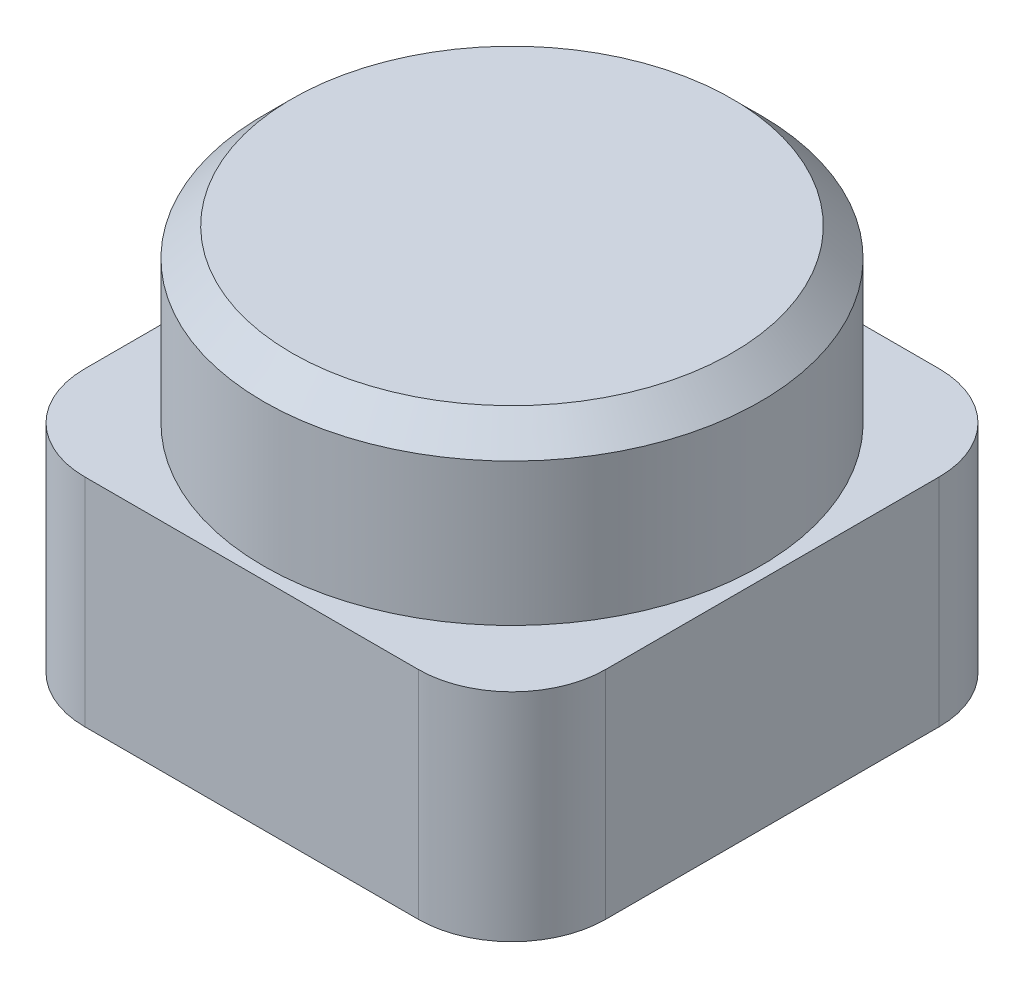
ISO-10303-21;
HEADER;
FILE_DESCRIPTION(('STEP AP214'),'2;1');
FILE_NAME('part.step','',(''),(''),'','','');
FILE_SCHEMA(('AUTOMOTIVE_DESIGN { 1 0 10303 214 1 1 1 1 }'));
ENDSEC;
DATA;
#1=APPLICATION_CONTEXT('core data for automotive mechanical design processes');
#2=APPLICATION_PROTOCOL_DEFINITION('international standard','automotive_design',2000,#1);
#3=PRODUCT_CONTEXT('',#1,'mechanical');
#4=PRODUCT('Part','Part','',(#3));
#5=PRODUCT_RELATED_PRODUCT_CATEGORY('part','',(#4));
#6=PRODUCT_DEFINITION_FORMATION('','',#4);
#7=PRODUCT_DEFINITION_CONTEXT('part definition',#1,'design');
#8=PRODUCT_DEFINITION('design','',#6,#7);
#9=PRODUCT_DEFINITION_SHAPE('','',#8);
#10=(LENGTH_UNIT() NAMED_UNIT(*) SI_UNIT(.MILLI.,.METRE.));
#11=(NAMED_UNIT(*) PLANE_ANGLE_UNIT() SI_UNIT($,.RADIAN.));
#12=(NAMED_UNIT(*) SI_UNIT($,.STERADIAN.) SOLID_ANGLE_UNIT());
#13=UNCERTAINTY_MEASURE_WITH_UNIT(LENGTH_MEASURE(1.E-05),#10,'distance_accuracy_value','');
#14=(GEOMETRIC_REPRESENTATION_CONTEXT(3) GLOBAL_UNCERTAINTY_ASSIGNED_CONTEXT((#13)) GLOBAL_UNIT_ASSIGNED_CONTEXT((#10,
#11,#12)) REPRESENTATION_CONTEXT('',''));
#15=CARTESIAN_POINT('',(0.,0.,0.));
#16=DIRECTION('',(0.,0.,1.));
#17=DIRECTION('',(1.,0.,0.));
#18=AXIS2_PLACEMENT_3D('',#15,#16,#17);
#19=CARTESIAN_POINT('',(0.,23.1,0.));
#20=DIRECTION('',(1.,0.,0.));
#21=DIRECTION('',(0.,0.,-1.));
#22=AXIS2_PLACEMENT_3D('',#19,#20,#21);
#23=PLANE('',#22);
#24=DIRECTION('',(0.,0.,1.));
#25=VECTOR('',#24,1.);
#26=CARTESIAN_POINT('',(0.,23.1,0.));
#27=LINE('',#26,#25);
#28=CARTESIAN_POINT('',(0.,23.1,-45.6));
#29=VERTEX_POINT('',#28);
#30=CARTESIAN_POINT('',(0.,23.1,-10.));
#31=VERTEX_POINT('',#30);
#32=EDGE_CURVE('E136',#29,#31,#27,.T.);
#33=ORIENTED_EDGE('',*,*,#32,.F.);
#34=DIRECTION('',(0.,-1.,0.));
#35=VECTOR('',#34,1.);
#36=CARTESIAN_POINT('',(0.,23.1,-45.6));
#37=LINE('',#36,#35);
#38=CARTESIAN_POINT('',(0.,0.,-45.6));
#39=VERTEX_POINT('',#38);
#40=EDGE_CURVE('E162',#29,#39,#37,.T.);
#41=ORIENTED_EDGE('',*,*,#40,.T.);
#42=DIRECTION('',(0.,0.,1.));
#43=VECTOR('',#42,1.);
#44=CARTESIAN_POINT('',(0.,0.,0.));
#45=LINE('',#44,#43);
#46=CARTESIAN_POINT('',(0.,0.,-10.));
#47=VERTEX_POINT('',#46);
#48=EDGE_CURVE('E199',#39,#47,#45,.T.);
#49=ORIENTED_EDGE('',*,*,#48,.T.);
#50=DIRECTION('',(0.,-1.,0.));
#51=VECTOR('',#50,1.);
#52=CARTESIAN_POINT('',(0.,23.1,-10.));
#53=LINE('',#52,#51);
#54=EDGE_CURVE('E160',#47,#31,#53,.F.);
#55=ORIENTED_EDGE('',*,*,#54,.T.);
#56=EDGE_LOOP('',(#33,#41,#49,#55));
#57=FACE_BOUND('',#56,.T.);
#58=ADVANCED_FACE('F42',(#57),#23,.F.);
#59=CARTESIAN_POINT('',(0.,23.1,0.));
#60=DIRECTION('',(0.,0.,-1.));
#61=DIRECTION('',(-1.,0.,0.));
#62=AXIS2_PLACEMENT_3D('',#59,#60,#61);
#63=PLANE('',#62);
#64=DIRECTION('',(1.,0.,0.));
#65=VECTOR('',#64,1.);
#66=CARTESIAN_POINT('',(0.,23.1,0.));
#67=LINE('',#66,#65);
#68=CARTESIAN_POINT('',(10.,23.1,0.));
#69=VERTEX_POINT('',#68);
#70=CARTESIAN_POINT('',(45.6,23.1,0.));
#71=VERTEX_POINT('',#70);
#72=EDGE_CURVE('E139',#69,#71,#67,.T.);
#73=ORIENTED_EDGE('',*,*,#72,.F.);
#74=DIRECTION('',(0.,-1.,0.));
#75=VECTOR('',#74,1.);
#76=CARTESIAN_POINT('',(10.,23.1,0.));
#77=LINE('',#76,#75);
#78=CARTESIAN_POINT('',(10.,0.,0.));
#79=VERTEX_POINT('',#78);
#80=EDGE_CURVE('E166',#69,#79,#77,.T.);
#81=ORIENTED_EDGE('',*,*,#80,.T.);
#82=DIRECTION('',(1.,0.,0.));
#83=VECTOR('',#82,1.);
#84=CARTESIAN_POINT('',(0.,0.,0.));
#85=LINE('',#84,#83);
#86=CARTESIAN_POINT('',(45.6,0.,0.));
#87=VERTEX_POINT('',#86);
#88=EDGE_CURVE('E141',#79,#87,#85,.T.);
#89=ORIENTED_EDGE('',*,*,#88,.T.);
#90=DIRECTION('',(0.,-1.,0.));
#91=VECTOR('',#90,1.);
#92=CARTESIAN_POINT('',(45.6,23.1,0.));
#93=LINE('',#92,#91);
#94=EDGE_CURVE('E58',#87,#71,#93,.F.);
#95=ORIENTED_EDGE('',*,*,#94,.T.);
#96=EDGE_LOOP('',(#73,#81,#89,#95));
#97=FACE_BOUND('',#96,.T.);
#98=ADVANCED_FACE('F209',(#97),#63,.F.);
#99=CARTESIAN_POINT('',(55.6,23.1,0.));
#100=DIRECTION('',(-1.,0.,0.));
#101=DIRECTION('',(0.,0.,1.));
#102=AXIS2_PLACEMENT_3D('',#99,#100,#101);
#103=PLANE('',#102);
#104=DIRECTION('',(0.,0.,-1.));
#105=VECTOR('',#104,1.);
#106=CARTESIAN_POINT('',(55.6,0.,0.));
#107=LINE('',#106,#105);
#108=CARTESIAN_POINT('',(55.6,0.,-10.));
#109=VERTEX_POINT('',#108);
#110=CARTESIAN_POINT('',(55.6,0.,-45.6));
#111=VERTEX_POINT('',#110);
#112=EDGE_CURVE('E137',#109,#111,#107,.T.);
#113=ORIENTED_EDGE('',*,*,#112,.T.);
#114=DIRECTION('',(0.,-1.,0.));
#115=VECTOR('',#114,1.);
#116=CARTESIAN_POINT('',(55.6,23.1,-45.6));
#117=LINE('',#116,#115);
#118=CARTESIAN_POINT('',(55.6,23.1,-45.6));
#119=VERTEX_POINT('',#118);
#120=EDGE_CURVE('E115',#111,#119,#117,.F.);
#121=ORIENTED_EDGE('',*,*,#120,.T.);
#122=DIRECTION('',(0.,0.,-1.));
#123=VECTOR('',#122,1.);
#124=CARTESIAN_POINT('',(55.6,23.1,0.));
#125=LINE('',#124,#123);
#126=CARTESIAN_POINT('',(55.6,23.1,-10.));
#127=VERTEX_POINT('',#126);
#128=EDGE_CURVE('E203',#127,#119,#125,.T.);
#129=ORIENTED_EDGE('',*,*,#128,.F.);
#130=DIRECTION('',(0.,-1.,0.));
#131=VECTOR('',#130,1.);
#132=CARTESIAN_POINT('',(55.6,23.1,-10.));
#133=LINE('',#132,#131);
#134=EDGE_CURVE('E120',#127,#109,#133,.T.);
#135=ORIENTED_EDGE('',*,*,#134,.T.);
#136=EDGE_LOOP('',(#113,#121,#129,#135));
#137=FACE_BOUND('',#136,.T.);
#138=ADVANCED_FACE('F218',(#137),#103,.F.);
#139=CARTESIAN_POINT('',(0.,23.1,-55.6));
#140=DIRECTION('',(0.,0.,1.));
#141=DIRECTION('',(1.,0.,0.));
#142=AXIS2_PLACEMENT_3D('',#139,#140,#141);
#143=PLANE('',#142);
#144=DIRECTION('',(-1.,0.,0.));
#145=VECTOR('',#144,1.);
#146=CARTESIAN_POINT('',(0.,23.1,-55.6));
#147=LINE('',#146,#145);
#148=CARTESIAN_POINT('',(45.6,23.1,-55.6));
#149=VERTEX_POINT('',#148);
#150=CARTESIAN_POINT('',(10.,23.1,-55.6));
#151=VERTEX_POINT('',#150);
#152=EDGE_CURVE('E130',#149,#151,#147,.T.);
#153=ORIENTED_EDGE('',*,*,#152,.F.);
#154=DIRECTION('',(0.,-1.,0.));
#155=VECTOR('',#154,1.);
#156=CARTESIAN_POINT('',(45.6,23.1,-55.6));
#157=LINE('',#156,#155);
#158=CARTESIAN_POINT('',(45.6,0.,-55.6));
#159=VERTEX_POINT('',#158);
#160=EDGE_CURVE('E114',#149,#159,#157,.T.);
#161=ORIENTED_EDGE('',*,*,#160,.T.);
#162=DIRECTION('',(-1.,0.,0.));
#163=VECTOR('',#162,1.);
#164=CARTESIAN_POINT('',(0.,0.,-55.6));
#165=LINE('',#164,#163);
#166=CARTESIAN_POINT('',(10.,0.,-55.6));
#167=VERTEX_POINT('',#166);
#168=EDGE_CURVE('E127',#159,#167,#165,.T.);
#169=ORIENTED_EDGE('',*,*,#168,.T.);
#170=DIRECTION('',(0.,-1.,0.));
#171=VECTOR('',#170,1.);
#172=CARTESIAN_POINT('',(10.,23.1,-55.6));
#173=LINE('',#172,#171);
#174=EDGE_CURVE('E132',#167,#151,#173,.F.);
#175=ORIENTED_EDGE('',*,*,#174,.T.);
#176=EDGE_LOOP('',(#153,#161,#169,#175));
#177=FACE_BOUND('',#176,.T.);
#178=ADVANCED_FACE('F126',(#177),#143,.F.);
#179=CARTESIAN_POINT('',(0.,23.1,0.));
#180=DIRECTION('',(0.,-1.,0.));
#181=DIRECTION('',(0.,0.,-1.));
#182=AXIS2_PLACEMENT_3D('',#179,#180,#181);
#183=PLANE('',#182);
#184=CARTESIAN_POINT('',(27.8,23.1,-27.8));
#185=DIRECTION('',(0.,1.,0.));
#186=DIRECTION('',(0.,0.,1.));
#187=AXIS2_PLACEMENT_3D('',#184,#185,#186);
#188=CIRCLE('',#187,26.5);
#189=CARTESIAN_POINT('',(27.8,23.1,-1.3));
#190=VERTEX_POINT('',#189);
#191=EDGE_CURVE('E168',#190,#190,#188,.T.);
#192=ORIENTED_EDGE('',*,*,#191,.F.);
#193=EDGE_LOOP('',(#192));
#194=FACE_BOUND('',#193,.T.);
#195=ORIENTED_EDGE('',*,*,#128,.T.);
#196=CARTESIAN_POINT('',(45.6,23.1,-45.6));
#197=DIRECTION('',(0.,-1.,0.));
#198=DIRECTION('',(0.,0.,-1.));
#199=AXIS2_PLACEMENT_3D('',#196,#197,#198);
#200=CIRCLE('',#199,10.);
#201=EDGE_CURVE('E158',#119,#149,#200,.F.);
#202=ORIENTED_EDGE('',*,*,#201,.T.);
#203=ORIENTED_EDGE('',*,*,#152,.T.);
#204=CARTESIAN_POINT('',(10.,23.1,-45.6));
#205=DIRECTION('',(0.,-1.,0.));
#206=DIRECTION('',(0.,0.,-1.));
#207=AXIS2_PLACEMENT_3D('',#204,#205,#206);
#208=CIRCLE('',#207,10.);
#209=EDGE_CURVE('E156',#151,#29,#208,.F.);
#210=ORIENTED_EDGE('',*,*,#209,.T.);
#211=ORIENTED_EDGE('',*,*,#32,.T.);
#212=CARTESIAN_POINT('',(10.,23.1,-10.));
#213=DIRECTION('',(0.,-1.,0.));
#214=DIRECTION('',(0.,0.,-1.));
#215=AXIS2_PLACEMENT_3D('',#212,#213,#214);
#216=CIRCLE('',#215,10.);
#217=EDGE_CURVE('E65',#31,#69,#216,.F.);
#218=ORIENTED_EDGE('',*,*,#217,.T.);
#219=ORIENTED_EDGE('',*,*,#72,.T.);
#220=CARTESIAN_POINT('',(45.6,23.1,-10.));
#221=DIRECTION('',(0.,-1.,0.));
#222=DIRECTION('',(0.,0.,-1.));
#223=AXIS2_PLACEMENT_3D('',#220,#221,#222);
#224=CIRCLE('',#223,10.);
#225=EDGE_CURVE('E153',#71,#127,#224,.F.);
#226=ORIENTED_EDGE('',*,*,#225,.T.);
#227=EDGE_LOOP('',(#195,#202,#203,#210,#211,#218,#219,#226));
#228=FACE_BOUND('',#227,.T.);
#229=ADVANCED_FACE('F216',(#194,#228),#183,.F.);
#230=CARTESIAN_POINT('',(0.,0.,0.));
#231=DIRECTION('',(0.,-1.,0.));
#232=DIRECTION('',(0.,0.,-1.));
#233=AXIS2_PLACEMENT_3D('',#230,#231,#232);
#234=PLANE('',#233);
#235=CARTESIAN_POINT('',(6.3,0.,-49.3));
#236=DIRECTION('',(0.,-1.,0.));
#237=DIRECTION('',(0.,0.,-1.));
#238=AXIS2_PLACEMENT_3D('',#235,#236,#237);
#239=CIRCLE('',#238,1.);
#240=CARTESIAN_POINT('',(6.3,0.,-50.3));
#241=VERTEX_POINT('',#240);
#242=EDGE_CURVE('E190',#241,#241,#239,.T.);
#243=ORIENTED_EDGE('',*,*,#242,.F.);
#244=EDGE_LOOP('',(#243));
#245=FACE_BOUND('',#244,.T.);
#246=CARTESIAN_POINT('',(49.3,0.,-49.3));
#247=DIRECTION('',(0.,-1.,0.));
#248=DIRECTION('',(0.,0.,-1.));
#249=AXIS2_PLACEMENT_3D('',#246,#247,#248);
#250=CIRCLE('',#249,0.999999999999998);
#251=CARTESIAN_POINT('',(49.3,0.,-50.3));
#252=VERTEX_POINT('',#251);
#253=EDGE_CURVE('E184',#252,#252,#250,.T.);
#254=ORIENTED_EDGE('',*,*,#253,.F.);
#255=EDGE_LOOP('',(#254));
#256=FACE_BOUND('',#255,.T.);
#257=CARTESIAN_POINT('',(49.3,0.,-6.3));
#258=DIRECTION('',(0.,-1.,0.));
#259=DIRECTION('',(0.,0.,-1.));
#260=AXIS2_PLACEMENT_3D('',#257,#258,#259);
#261=CIRCLE('',#260,0.999999999999998);
#262=CARTESIAN_POINT('',(49.3,0.,-7.3));
#263=VERTEX_POINT('',#262);
#264=EDGE_CURVE('E177',#263,#263,#261,.T.);
#265=ORIENTED_EDGE('',*,*,#264,.F.);
#266=EDGE_LOOP('',(#265));
#267=FACE_BOUND('',#266,.T.);
#268=CARTESIAN_POINT('',(6.3,0.,-6.3));
#269=DIRECTION('',(0.,-1.,0.));
#270=DIRECTION('',(0.,0.,-1.));
#271=AXIS2_PLACEMENT_3D('',#268,#269,#270);
#272=CIRCLE('',#271,1.);
#273=CARTESIAN_POINT('',(6.3,0.,-7.3));
#274=VERTEX_POINT('',#273);
#275=EDGE_CURVE('E180',#274,#274,#272,.T.);
#276=ORIENTED_EDGE('',*,*,#275,.F.);
#277=EDGE_LOOP('',(#276));
#278=FACE_BOUND('',#277,.T.);
#279=ORIENTED_EDGE('',*,*,#168,.F.);
#280=CARTESIAN_POINT('',(45.6,0.,-45.6));
#281=DIRECTION('',(0.,-1.,0.));
#282=DIRECTION('',(0.,0.,-1.));
#283=AXIS2_PLACEMENT_3D('',#280,#281,#282);
#284=CIRCLE('',#283,10.);
#285=EDGE_CURVE('E110',#159,#111,#284,.T.);
#286=ORIENTED_EDGE('',*,*,#285,.T.);
#287=ORIENTED_EDGE('',*,*,#112,.F.);
#288=CARTESIAN_POINT('',(45.6,0.,-10.));
#289=DIRECTION('',(0.,-1.,0.));
#290=DIRECTION('',(0.,0.,-1.));
#291=AXIS2_PLACEMENT_3D('',#288,#289,#290);
#292=CIRCLE('',#291,10.);
#293=EDGE_CURVE('E131',#109,#87,#292,.T.);
#294=ORIENTED_EDGE('',*,*,#293,.T.);
#295=ORIENTED_EDGE('',*,*,#88,.F.);
#296=CARTESIAN_POINT('',(10.,0.,-10.));
#297=DIRECTION('',(0.,-1.,0.));
#298=DIRECTION('',(0.,0.,-1.));
#299=AXIS2_PLACEMENT_3D('',#296,#297,#298);
#300=CIRCLE('',#299,10.);
#301=EDGE_CURVE('E147',#79,#47,#300,.T.);
#302=ORIENTED_EDGE('',*,*,#301,.T.);
#303=ORIENTED_EDGE('',*,*,#48,.F.);
#304=CARTESIAN_POINT('',(10.,0.,-45.6));
#305=DIRECTION('',(0.,-1.,0.));
#306=DIRECTION('',(0.,0.,-1.));
#307=AXIS2_PLACEMENT_3D('',#304,#305,#306);
#308=CIRCLE('',#307,10.);
#309=EDGE_CURVE('E121',#39,#167,#308,.T.);
#310=ORIENTED_EDGE('',*,*,#309,.T.);
#311=EDGE_LOOP('',(#279,#286,#287,#294,#295,#302,#303,#310));
#312=FACE_BOUND('',#311,.T.);
#313=ADVANCED_FACE('F134',(#245,#256,#267,#278,#312),#234,.T.);
#314=CARTESIAN_POINT('',(45.6,23.1,-45.6));
#315=DIRECTION('',(0.,-1.,0.));
#316=DIRECTION('',(0.,0.,-1.));
#317=AXIS2_PLACEMENT_3D('',#314,#315,#316);
#318=CYLINDRICAL_SURFACE('',#317,10.);
#319=ORIENTED_EDGE('',*,*,#201,.F.);
#320=ORIENTED_EDGE('',*,*,#120,.F.);
#321=ORIENTED_EDGE('',*,*,#285,.F.);
#322=ORIENTED_EDGE('',*,*,#160,.F.);
#323=EDGE_LOOP('',(#319,#320,#321,#322));
#324=FACE_BOUND('',#323,.T.);
#325=ADVANCED_FACE('F113',(#324),#318,.T.);
#326=CARTESIAN_POINT('',(10.,23.1,-45.6));
#327=DIRECTION('',(0.,-1.,0.));
#328=DIRECTION('',(0.,0.,-1.));
#329=AXIS2_PLACEMENT_3D('',#326,#327,#328);
#330=CYLINDRICAL_SURFACE('',#329,10.);
#331=ORIENTED_EDGE('',*,*,#209,.F.);
#332=ORIENTED_EDGE('',*,*,#174,.F.);
#333=ORIENTED_EDGE('',*,*,#309,.F.);
#334=ORIENTED_EDGE('',*,*,#40,.F.);
#335=EDGE_LOOP('',(#331,#332,#333,#334));
#336=FACE_BOUND('',#335,.T.);
#337=ADVANCED_FACE('F236',(#336),#330,.T.);
#338=CARTESIAN_POINT('',(10.,23.1,-10.));
#339=DIRECTION('',(0.,-1.,0.));
#340=DIRECTION('',(0.,0.,-1.));
#341=AXIS2_PLACEMENT_3D('',#338,#339,#340);
#342=CYLINDRICAL_SURFACE('',#341,10.);
#343=ORIENTED_EDGE('',*,*,#217,.F.);
#344=ORIENTED_EDGE('',*,*,#54,.F.);
#345=ORIENTED_EDGE('',*,*,#301,.F.);
#346=ORIENTED_EDGE('',*,*,#80,.F.);
#347=EDGE_LOOP('',(#343,#344,#345,#346));
#348=FACE_BOUND('',#347,.T.);
#349=ADVANCED_FACE('F239',(#348),#342,.T.);
#350=CARTESIAN_POINT('',(45.6,23.1,-10.));
#351=DIRECTION('',(0.,-1.,0.));
#352=DIRECTION('',(0.,0.,-1.));
#353=AXIS2_PLACEMENT_3D('',#350,#351,#352);
#354=CYLINDRICAL_SURFACE('',#353,10.);
#355=ORIENTED_EDGE('',*,*,#225,.F.);
#356=ORIENTED_EDGE('',*,*,#94,.F.);
#357=ORIENTED_EDGE('',*,*,#293,.F.);
#358=ORIENTED_EDGE('',*,*,#134,.F.);
#359=EDGE_LOOP('',(#355,#356,#357,#358));
#360=FACE_BOUND('',#359,.T.);
#361=ADVANCED_FACE('F213',(#360),#354,.T.);
#362=CARTESIAN_POINT('',(6.3,4.,-6.3));
#363=DIRECTION('',(0.,-1.,0.));
#364=DIRECTION('',(0.,0.,-1.));
#365=AXIS2_PLACEMENT_3D('',#362,#363,#364);
#366=CYLINDRICAL_SURFACE('',#365,1.);
#367=CARTESIAN_POINT('',(6.3,4.,-6.3));
#368=DIRECTION('',(0.,-1.,0.));
#369=DIRECTION('',(0.,0.,-1.));
#370=AXIS2_PLACEMENT_3D('',#367,#368,#369);
#371=CIRCLE('',#370,1.);
#372=CARTESIAN_POINT('',(6.3,4.,-7.3));
#373=VERTEX_POINT('',#372);
#374=EDGE_CURVE('E196',#373,#373,#371,.T.);
#375=ORIENTED_EDGE('',*,*,#374,.F.);
#376=EDGE_LOOP('',(#375));
#377=FACE_BOUND('',#376,.T.);
#378=ORIENTED_EDGE('',*,*,#275,.T.);
#379=EDGE_LOOP('',(#378));
#380=FACE_BOUND('',#379,.T.);
#381=ADVANCED_FACE('F244',(#377,#380),#366,.F.);
#382=CARTESIAN_POINT('',(6.3,4.,-6.3));
#383=DIRECTION('',(0.,-1.,0.));
#384=DIRECTION('',(0.,0.,-1.));
#385=AXIS2_PLACEMENT_3D('',#382,#383,#384);
#386=PLANE('',#385);
#387=ORIENTED_EDGE('',*,*,#374,.T.);
#388=EDGE_LOOP('',(#387));
#389=FACE_BOUND('',#388,.T.);
#390=ADVANCED_FACE('F249',(#389),#386,.T.);
#391=CARTESIAN_POINT('',(49.3,4.,-6.3));
#392=DIRECTION('',(0.,-1.,0.));
#393=DIRECTION('',(0.,0.,-1.));
#394=AXIS2_PLACEMENT_3D('',#391,#392,#393);
#395=CYLINDRICAL_SURFACE('',#394,0.999999999999998);
#396=CARTESIAN_POINT('',(49.3,4.,-6.3));
#397=DIRECTION('',(0.,-1.,0.));
#398=DIRECTION('',(0.,0.,-1.));
#399=AXIS2_PLACEMENT_3D('',#396,#397,#398);
#400=CIRCLE('',#399,0.999999999999998);
#401=CARTESIAN_POINT('',(49.3,4.,-7.3));
#402=VERTEX_POINT('',#401);
#403=EDGE_CURVE('E181',#402,#402,#400,.T.);
#404=ORIENTED_EDGE('',*,*,#403,.F.);
#405=EDGE_LOOP('',(#404));
#406=FACE_BOUND('',#405,.T.);
#407=ORIENTED_EDGE('',*,*,#264,.T.);
#408=EDGE_LOOP('',(#407));
#409=FACE_BOUND('',#408,.T.);
#410=ADVANCED_FACE('F255',(#406,#409),#395,.F.);
#411=CARTESIAN_POINT('',(49.3,4.,-6.3));
#412=DIRECTION('',(0.,-1.,0.));
#413=DIRECTION('',(0.,0.,-1.));
#414=AXIS2_PLACEMENT_3D('',#411,#412,#413);
#415=PLANE('',#414);
#416=ORIENTED_EDGE('',*,*,#403,.T.);
#417=EDGE_LOOP('',(#416));
#418=FACE_BOUND('',#417,.T.);
#419=ADVANCED_FACE('F277',(#418),#415,.T.);
#420=CARTESIAN_POINT('',(49.3,4.,-49.3));
#421=DIRECTION('',(0.,-1.,0.));
#422=DIRECTION('',(0.,0.,-1.));
#423=AXIS2_PLACEMENT_3D('',#420,#421,#422);
#424=CYLINDRICAL_SURFACE('',#423,0.999999999999998);
#425=CARTESIAN_POINT('',(49.3,4.,-49.3));
#426=DIRECTION('',(0.,-1.,0.));
#427=DIRECTION('',(0.,0.,-1.));
#428=AXIS2_PLACEMENT_3D('',#425,#426,#427);
#429=CIRCLE('',#428,0.999999999999998);
#430=CARTESIAN_POINT('',(49.3,4.,-50.3));
#431=VERTEX_POINT('',#430);
#432=EDGE_CURVE('E187',#431,#431,#429,.T.);
#433=ORIENTED_EDGE('',*,*,#432,.F.);
#434=EDGE_LOOP('',(#433));
#435=FACE_BOUND('',#434,.T.);
#436=ORIENTED_EDGE('',*,*,#253,.T.);
#437=EDGE_LOOP('',(#436));
#438=FACE_BOUND('',#437,.T.);
#439=ADVANCED_FACE('F283',(#435,#438),#424,.F.);
#440=CARTESIAN_POINT('',(49.3,4.,-49.3));
#441=DIRECTION('',(0.,-1.,0.));
#442=DIRECTION('',(0.,0.,-1.));
#443=AXIS2_PLACEMENT_3D('',#440,#441,#442);
#444=PLANE('',#443);
#445=ORIENTED_EDGE('',*,*,#432,.T.);
#446=EDGE_LOOP('',(#445));
#447=FACE_BOUND('',#446,.T.);
#448=ADVANCED_FACE('F293',(#447),#444,.T.);
#449=CARTESIAN_POINT('',(6.3,4.,-49.3));
#450=DIRECTION('',(0.,-1.,0.));
#451=DIRECTION('',(0.,0.,-1.));
#452=AXIS2_PLACEMENT_3D('',#449,#450,#451);
#453=CYLINDRICAL_SURFACE('',#452,1.);
#454=CARTESIAN_POINT('',(6.3,4.,-49.3));
#455=DIRECTION('',(0.,-1.,0.));
#456=DIRECTION('',(0.,0.,-1.));
#457=AXIS2_PLACEMENT_3D('',#454,#455,#456);
#458=CIRCLE('',#457,1.);
#459=CARTESIAN_POINT('',(6.3,4.,-50.3));
#460=VERTEX_POINT('',#459);
#461=EDGE_CURVE('E193',#460,#460,#458,.T.);
#462=ORIENTED_EDGE('',*,*,#461,.F.);
#463=EDGE_LOOP('',(#462));
#464=FACE_BOUND('',#463,.T.);
#465=ORIENTED_EDGE('',*,*,#242,.T.);
#466=EDGE_LOOP('',(#465));
#467=FACE_BOUND('',#466,.T.);
#468=ADVANCED_FACE('F297',(#464,#467),#453,.F.);
#469=CARTESIAN_POINT('',(6.3,4.,-49.3));
#470=DIRECTION('',(0.,-1.,0.));
#471=DIRECTION('',(0.,0.,-1.));
#472=AXIS2_PLACEMENT_3D('',#469,#470,#471);
#473=PLANE('',#472);
#474=ORIENTED_EDGE('',*,*,#461,.T.);
#475=EDGE_LOOP('',(#474));
#476=FACE_BOUND('',#475,.T.);
#477=ADVANCED_FACE('F300',(#476),#473,.T.);
#478=CARTESIAN_POINT('',(27.8,41.3,-27.8));
#479=DIRECTION('',(0.,-1.,0.));
#480=DIRECTION('',(0.,0.,-1.));
#481=AXIS2_PLACEMENT_3D('',#478,#479,#480);
#482=CYLINDRICAL_SURFACE('',#481,26.5);
#483=CARTESIAN_POINT('',(27.8,38.3,-27.8));
#484=DIRECTION('',(0.,1.,0.));
#485=DIRECTION('',(0.,0.,1.));
#486=AXIS2_PLACEMENT_3D('',#483,#484,#485);
#487=CIRCLE('',#486,26.5);
#488=CARTESIAN_POINT('',(27.8,38.3,-1.3));
#489=VERTEX_POINT('',#488);
#490=EDGE_CURVE('E11',#489,#489,#487,.F.);
#491=ORIENTED_EDGE('',*,*,#490,.T.);
#492=EDGE_LOOP('',(#491));
#493=FACE_BOUND('',#492,.T.);
#494=ORIENTED_EDGE('',*,*,#191,.T.);
#495=EDGE_LOOP('',(#494));
#496=FACE_BOUND('',#495,.T.);
#497=ADVANCED_FACE('F288',(#493,#496),#482,.T.);
#498=CARTESIAN_POINT('',(27.8,41.3,-27.8));
#499=DIRECTION('',(0.,1.,0.));
#500=DIRECTION('',(0.,0.,1.));
#501=AXIS2_PLACEMENT_3D('',#498,#499,#500);
#502=PLANE('',#501);
#503=CARTESIAN_POINT('',(27.8,41.3,-27.8));
#504=DIRECTION('',(0.,1.,0.));
#505=DIRECTION('',(0.,0.,1.));
#506=AXIS2_PLACEMENT_3D('',#503,#504,#505);
#507=CIRCLE('',#506,23.5);
#508=CARTESIAN_POINT('',(27.8,41.3,-4.30000000000001));
#509=VERTEX_POINT('',#508);
#510=EDGE_CURVE('E51',#509,#509,#507,.T.);
#511=ORIENTED_EDGE('',*,*,#510,.T.);
#512=EDGE_LOOP('',(#511));
#513=FACE_BOUND('',#512,.T.);
#514=ADVANCED_FACE('F307',(#513),#502,.T.);
#515=CARTESIAN_POINT('',(27.8,41.3,-27.8));
#516=DIRECTION('',(0.,-1.,0.));
#517=DIRECTION('',(0.,0.,-1.));
#518=AXIS2_PLACEMENT_3D('',#515,#516,#517);
#519=CONICAL_SURFACE('',#518,23.5,0.785398163397444);
#520=ORIENTED_EDGE('',*,*,#490,.F.);
#521=EDGE_LOOP('',(#520));
#522=FACE_BOUND('',#521,.T.);
#523=ORIENTED_EDGE('',*,*,#510,.F.);
#524=EDGE_LOOP('',(#523));
#525=FACE_BOUND('',#524,.T.);
#526=ADVANCED_FACE('F45',(#522,#525),#519,.T.);
#527=CLOSED_SHELL('',(#58,#98,#138,#178,#229,#313,#325,#337,#349,#361,#381,#390,#410,#419,#439,
#448,#468,#477,#497,#514,#526));
#528=MANIFOLD_SOLID_BREP('B2',#527);
#529=ADVANCED_BREP_SHAPE_REPRESENTATION('',(#18,#528),#14);
#530=SHAPE_DEFINITION_REPRESENTATION(#9,#529);
ENDSEC;
END-ISO-10303-21;
